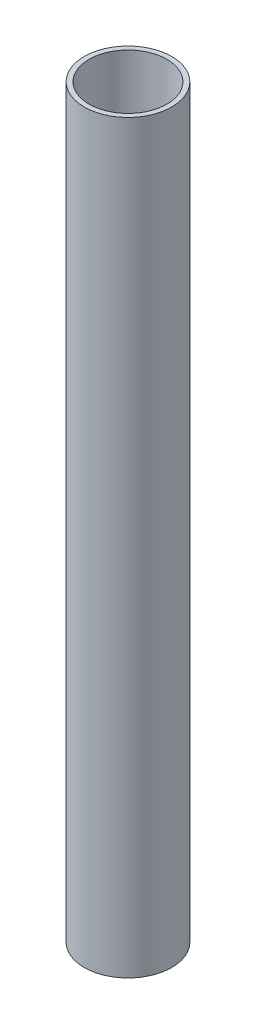
ISO-10303-21;
HEADER;
FILE_DESCRIPTION(('STEP AP214'),'2;1');
FILE_NAME('part.step','',(''),(''),'','','');
FILE_SCHEMA(('AUTOMOTIVE_DESIGN { 1 0 10303 214 1 1 1 1 }'));
ENDSEC;
DATA;
#1=APPLICATION_CONTEXT('core data for automotive mechanical design processes');
#2=APPLICATION_PROTOCOL_DEFINITION('international standard','automotive_design',2000,#1);
#3=PRODUCT_CONTEXT('',#1,'mechanical');
#4=PRODUCT('Part','Part','',(#3));
#5=PRODUCT_RELATED_PRODUCT_CATEGORY('part','',(#4));
#6=PRODUCT_DEFINITION_FORMATION('','',#4);
#7=PRODUCT_DEFINITION_CONTEXT('part definition',#1,'design');
#8=PRODUCT_DEFINITION('design','',#6,#7);
#9=PRODUCT_DEFINITION_SHAPE('','',#8);
#10=(LENGTH_UNIT() NAMED_UNIT(*) SI_UNIT(.MILLI.,.METRE.));
#11=(NAMED_UNIT(*) PLANE_ANGLE_UNIT() SI_UNIT($,.RADIAN.));
#12=(NAMED_UNIT(*) SI_UNIT($,.STERADIAN.) SOLID_ANGLE_UNIT());
#13=UNCERTAINTY_MEASURE_WITH_UNIT(LENGTH_MEASURE(1.E-05),#10,'distance_accuracy_value','');
#14=(GEOMETRIC_REPRESENTATION_CONTEXT(3) GLOBAL_UNCERTAINTY_ASSIGNED_CONTEXT((#13)) GLOBAL_UNIT_ASSIGNED_CONTEXT((#10,
#11,#12)) REPRESENTATION_CONTEXT('',''));
#15=CARTESIAN_POINT('',(0.,0.,0.));
#16=DIRECTION('',(0.,0.,1.));
#17=DIRECTION('',(1.,0.,0.));
#18=AXIS2_PLACEMENT_3D('',#15,#16,#17);
#19=CARTESIAN_POINT('',(0.,486.664,0.));
#20=DIRECTION('',(0.,1.,0.));
#21=DIRECTION('',(0.,0.,1.));
#22=AXIS2_PLACEMENT_3D('',#19,#20,#21);
#23=PLANE('',#22);
#24=CARTESIAN_POINT('',(0.,486.664,0.));
#25=DIRECTION('',(0.,1.,0.));
#26=DIRECTION('',(0.,0.,1.));
#27=AXIS2_PLACEMENT_3D('',#24,#25,#26);
#28=CIRCLE('',#27,57.15);
#29=CARTESIAN_POINT('',(0.,486.664,57.15));
#30=VERTEX_POINT('',#29);
#31=EDGE_CURVE('E10',#30,#30,#28,.T.);
#32=ORIENTED_EDGE('',*,*,#31,.T.);
#33=EDGE_LOOP('',(#32));
#34=FACE_BOUND('',#33,.T.);
#35=CARTESIAN_POINT('',(0.,486.664,0.));
#36=DIRECTION('',(0.,1.,0.));
#37=DIRECTION('',(0.,0.,1.));
#38=AXIS2_PLACEMENT_3D('',#35,#36,#37);
#39=CIRCLE('',#38,50.8);
#40=CARTESIAN_POINT('',(0.,486.664,50.8));
#41=VERTEX_POINT('',#40);
#42=EDGE_CURVE('E48',#41,#41,#39,.T.);
#43=ORIENTED_EDGE('',*,*,#42,.F.);
#44=EDGE_LOOP('',(#43));
#45=FACE_BOUND('',#44,.T.);
#46=ADVANCED_FACE('F37',(#34,#45),#23,.T.);
#47=CARTESIAN_POINT('',(0.,-486.664,0.));
#48=DIRECTION('',(0.,1.,0.));
#49=DIRECTION('',(0.,0.,1.));
#50=AXIS2_PLACEMENT_3D('',#47,#48,#49);
#51=PLANE('',#50);
#52=CARTESIAN_POINT('',(0.,-486.664,0.));
#53=DIRECTION('',(0.,1.,0.));
#54=DIRECTION('',(0.,0.,1.));
#55=AXIS2_PLACEMENT_3D('',#52,#53,#54);
#56=CIRCLE('',#55,57.15);
#57=CARTESIAN_POINT('',(0.,-486.664,57.15));
#58=VERTEX_POINT('',#57);
#59=EDGE_CURVE('E41',#58,#58,#56,.T.);
#60=ORIENTED_EDGE('',*,*,#59,.F.);
#61=EDGE_LOOP('',(#60));
#62=FACE_BOUND('',#61,.T.);
#63=CARTESIAN_POINT('',(0.,-486.664,0.));
#64=DIRECTION('',(0.,1.,0.));
#65=DIRECTION('',(0.,0.,1.));
#66=AXIS2_PLACEMENT_3D('',#63,#64,#65);
#67=CIRCLE('',#66,50.8);
#68=CARTESIAN_POINT('',(0.,-486.664,50.8));
#69=VERTEX_POINT('',#68);
#70=EDGE_CURVE('E50',#69,#69,#67,.T.);
#71=ORIENTED_EDGE('',*,*,#70,.T.);
#72=EDGE_LOOP('',(#71));
#73=FACE_BOUND('',#72,.T.);
#74=ADVANCED_FACE('F60',(#62,#73),#51,.F.);
#75=CARTESIAN_POINT('',(0.,486.664,0.));
#76=DIRECTION('',(0.,-1.,0.));
#77=DIRECTION('',(0.,0.,-1.));
#78=AXIS2_PLACEMENT_3D('',#75,#76,#77);
#79=CYLINDRICAL_SURFACE('',#78,57.15);
#80=ORIENTED_EDGE('',*,*,#31,.F.);
#81=EDGE_LOOP('',(#80));
#82=FACE_BOUND('',#81,.T.);
#83=ORIENTED_EDGE('',*,*,#59,.T.);
#84=EDGE_LOOP('',(#83));
#85=FACE_BOUND('',#84,.T.);
#86=ADVANCED_FACE('F39',(#82,#85),#79,.T.);
#87=CARTESIAN_POINT('',(0.,486.664,0.));
#88=DIRECTION('',(0.,-1.,0.));
#89=DIRECTION('',(0.,0.,-1.));
#90=AXIS2_PLACEMENT_3D('',#87,#88,#89);
#91=CYLINDRICAL_SURFACE('',#90,50.8);
#92=ORIENTED_EDGE('',*,*,#42,.T.);
#93=EDGE_LOOP('',(#92));
#94=FACE_BOUND('',#93,.T.);
#95=ORIENTED_EDGE('',*,*,#70,.F.);
#96=EDGE_LOOP('',(#95));
#97=FACE_BOUND('',#96,.T.);
#98=ADVANCED_FACE('F56',(#94,#97),#91,.F.);
#99=CLOSED_SHELL('',(#46,#74,#86,#98));
#100=MANIFOLD_SOLID_BREP('B2',#99);
#101=ADVANCED_BREP_SHAPE_REPRESENTATION('',(#18,#100),#14);
#102=SHAPE_DEFINITION_REPRESENTATION(#9,#101);
ENDSEC;
END-ISO-10303-21;
